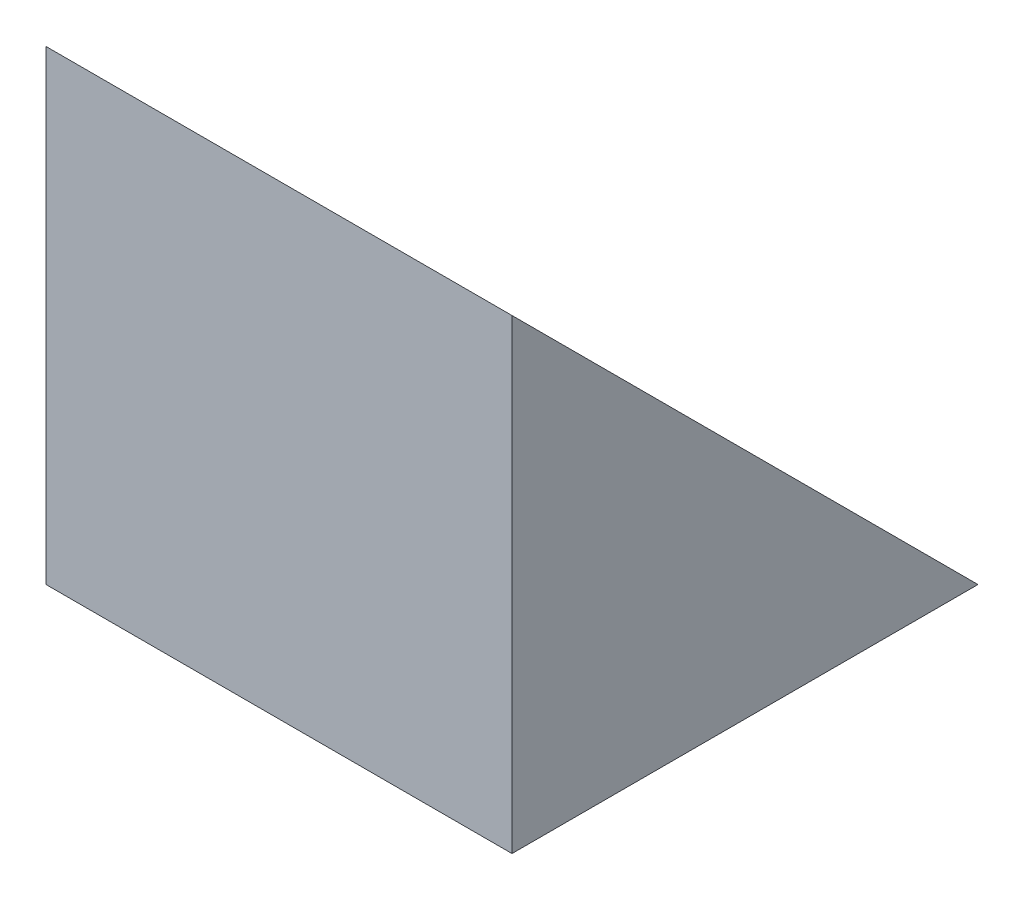
ISO-10303-21;
HEADER;
FILE_DESCRIPTION(('STEP AP214'),'2;1');
FILE_NAME('part.step','',(''),(''),'','','');
FILE_SCHEMA(('AUTOMOTIVE_DESIGN { 1 0 10303 214 1 1 1 1 }'));
ENDSEC;
DATA;
#1=APPLICATION_CONTEXT('core data for automotive mechanical design processes');
#2=APPLICATION_PROTOCOL_DEFINITION('international standard','automotive_design',2000,#1);
#3=PRODUCT_CONTEXT('',#1,'mechanical');
#4=PRODUCT('Part','Part','',(#3));
#5=PRODUCT_RELATED_PRODUCT_CATEGORY('part','',(#4));
#6=PRODUCT_DEFINITION_FORMATION('','',#4);
#7=PRODUCT_DEFINITION_CONTEXT('part definition',#1,'design');
#8=PRODUCT_DEFINITION('design','',#6,#7);
#9=PRODUCT_DEFINITION_SHAPE('','',#8);
#10=(LENGTH_UNIT() NAMED_UNIT(*) SI_UNIT(.MILLI.,.METRE.));
#11=(NAMED_UNIT(*) PLANE_ANGLE_UNIT() SI_UNIT($,.RADIAN.));
#12=(NAMED_UNIT(*) SI_UNIT($,.STERADIAN.) SOLID_ANGLE_UNIT());
#13=UNCERTAINTY_MEASURE_WITH_UNIT(LENGTH_MEASURE(1.E-05),#10,'distance_accuracy_value','');
#14=(GEOMETRIC_REPRESENTATION_CONTEXT(3) GLOBAL_UNCERTAINTY_ASSIGNED_CONTEXT((#13)) GLOBAL_UNIT_ASSIGNED_CONTEXT((#10,
#11,#12)) REPRESENTATION_CONTEXT('',''));
#15=CARTESIAN_POINT('',(0.,0.,0.));
#16=DIRECTION('',(0.,0.,1.));
#17=DIRECTION('',(1.,0.,0.));
#18=AXIS2_PLACEMENT_3D('',#15,#16,#17);
#19=CARTESIAN_POINT('',(40.,40.,40.));
#20=DIRECTION('',(0.,-0.707106781186548,0.707106781186547));
#21=DIRECTION('',(0.,-0.707106781186547,-0.707106781186548));
#22=AXIS2_PLACEMENT_3D('',#19,#20,#21);
#23=PLANE('',#22);
#24=DIRECTION('',(0.,0.707106781186547,0.707106781186548));
#25=VECTOR('',#24,1.);
#26=CARTESIAN_POINT('',(0.,40.,40.));
#27=LINE('',#26,#25);
#28=CARTESIAN_POINT('',(0.,0.,0.));
#29=VERTEX_POINT('',#28);
#30=CARTESIAN_POINT('',(0.,40.,40.));
#31=VERTEX_POINT('',#30);
#32=EDGE_CURVE('E89',#29,#31,#27,.T.);
#33=ORIENTED_EDGE('',*,*,#32,.T.);
#34=DIRECTION('',(-1.,0.,0.));
#35=VECTOR('',#34,1.);
#36=CARTESIAN_POINT('',(40.,40.,40.));
#37=LINE('',#36,#35);
#38=CARTESIAN_POINT('',(40.,40.,40.));
#39=VERTEX_POINT('',#38);
#40=EDGE_CURVE('E11',#39,#31,#37,.T.);
#41=ORIENTED_EDGE('',*,*,#40,.F.);
#42=DIRECTION('',(0.,0.707106781186547,0.707106781186548));
#43=VECTOR('',#42,1.);
#44=CARTESIAN_POINT('',(40.,40.,40.));
#45=LINE('',#44,#43);
#46=CARTESIAN_POINT('',(40.,0.,0.));
#47=VERTEX_POINT('',#46);
#48=EDGE_CURVE('E81',#47,#39,#45,.T.);
#49=ORIENTED_EDGE('',*,*,#48,.F.);
#50=DIRECTION('',(-1.,0.,0.));
#51=VECTOR('',#50,1.);
#52=CARTESIAN_POINT('',(40.,0.,0.));
#53=LINE('',#52,#51);
#54=EDGE_CURVE('E90',#47,#29,#53,.T.);
#55=ORIENTED_EDGE('',*,*,#54,.T.);
#56=EDGE_LOOP('',(#33,#41,#49,#55));
#57=FACE_BOUND('',#56,.T.);
#58=ADVANCED_FACE('F39',(#57),#23,.F.);
#59=CARTESIAN_POINT('',(40.,0.,40.));
#60=DIRECTION('',(0.,0.,-1.));
#61=DIRECTION('',(-1.,0.,0.));
#62=AXIS2_PLACEMENT_3D('',#59,#60,#61);
#63=PLANE('',#62);
#64=DIRECTION('',(0.,-1.,0.));
#65=VECTOR('',#64,1.);
#66=CARTESIAN_POINT('',(0.,0.,40.));
#67=LINE('',#66,#65);
#68=CARTESIAN_POINT('',(0.,0.,40.));
#69=VERTEX_POINT('',#68);
#70=EDGE_CURVE('E68',#31,#69,#67,.T.);
#71=ORIENTED_EDGE('',*,*,#70,.T.);
#72=DIRECTION('',(-1.,0.,0.));
#73=VECTOR('',#72,1.);
#74=CARTESIAN_POINT('',(40.,0.,40.));
#75=LINE('',#74,#73);
#76=CARTESIAN_POINT('',(40.,0.,40.));
#77=VERTEX_POINT('',#76);
#78=EDGE_CURVE('E48',#77,#69,#75,.T.);
#79=ORIENTED_EDGE('',*,*,#78,.F.);
#80=DIRECTION('',(0.,-1.,0.));
#81=VECTOR('',#80,1.);
#82=CARTESIAN_POINT('',(40.,0.,40.));
#83=LINE('',#82,#81);
#84=EDGE_CURVE('E76',#39,#77,#83,.T.);
#85=ORIENTED_EDGE('',*,*,#84,.F.);
#86=ORIENTED_EDGE('',*,*,#40,.T.);
#87=EDGE_LOOP('',(#71,#79,#85,#86));
#88=FACE_BOUND('',#87,.T.);
#89=ADVANCED_FACE('F77',(#88),#63,.F.);
#90=CARTESIAN_POINT('',(40.,0.,0.));
#91=DIRECTION('',(0.,1.,0.));
#92=DIRECTION('',(0.,0.,1.));
#93=AXIS2_PLACEMENT_3D('',#90,#91,#92);
#94=PLANE('',#93);
#95=DIRECTION('',(0.,0.,-1.));
#96=VECTOR('',#95,1.);
#97=CARTESIAN_POINT('',(0.,0.,0.));
#98=LINE('',#97,#96);
#99=EDGE_CURVE('E73',#69,#29,#98,.T.);
#100=ORIENTED_EDGE('',*,*,#99,.T.);
#101=ORIENTED_EDGE('',*,*,#54,.F.);
#102=DIRECTION('',(0.,0.,-1.));
#103=VECTOR('',#102,1.);
#104=CARTESIAN_POINT('',(40.,0.,0.));
#105=LINE('',#104,#103);
#106=EDGE_CURVE('E56',#77,#47,#105,.T.);
#107=ORIENTED_EDGE('',*,*,#106,.F.);
#108=ORIENTED_EDGE('',*,*,#78,.T.);
#109=EDGE_LOOP('',(#100,#101,#107,#108));
#110=FACE_BOUND('',#109,.T.);
#111=ADVANCED_FACE('F102',(#110),#94,.F.);
#112=CARTESIAN_POINT('',(40.,0.,0.));
#113=DIRECTION('',(-1.,0.,0.));
#114=DIRECTION('',(0.,0.,1.));
#115=AXIS2_PLACEMENT_3D('',#112,#113,#114);
#116=PLANE('',#115);
#117=ORIENTED_EDGE('',*,*,#48,.T.);
#118=ORIENTED_EDGE('',*,*,#84,.T.);
#119=ORIENTED_EDGE('',*,*,#106,.T.);
#120=EDGE_LOOP('',(#117,#118,#119));
#121=FACE_BOUND('',#120,.T.);
#122=ADVANCED_FACE('F84',(#121),#116,.F.);
#123=CARTESIAN_POINT('',(0.,0.,0.));
#124=DIRECTION('',(-1.,0.,0.));
#125=DIRECTION('',(0.,0.,1.));
#126=AXIS2_PLACEMENT_3D('',#123,#124,#125);
#127=PLANE('',#126);
#128=ORIENTED_EDGE('',*,*,#32,.F.);
#129=ORIENTED_EDGE('',*,*,#99,.F.);
#130=ORIENTED_EDGE('',*,*,#70,.F.);
#131=EDGE_LOOP('',(#128,#129,#130));
#132=FACE_BOUND('',#131,.T.);
#133=ADVANCED_FACE('F103',(#132),#127,.T.);
#134=CLOSED_SHELL('',(#58,#89,#111,#122,#133));
#135=MANIFOLD_SOLID_BREP('B2',#134);
#136=ADVANCED_BREP_SHAPE_REPRESENTATION('',(#18,#135),#14);
#137=SHAPE_DEFINITION_REPRESENTATION(#9,#136);
ENDSEC;
END-ISO-10303-21;
